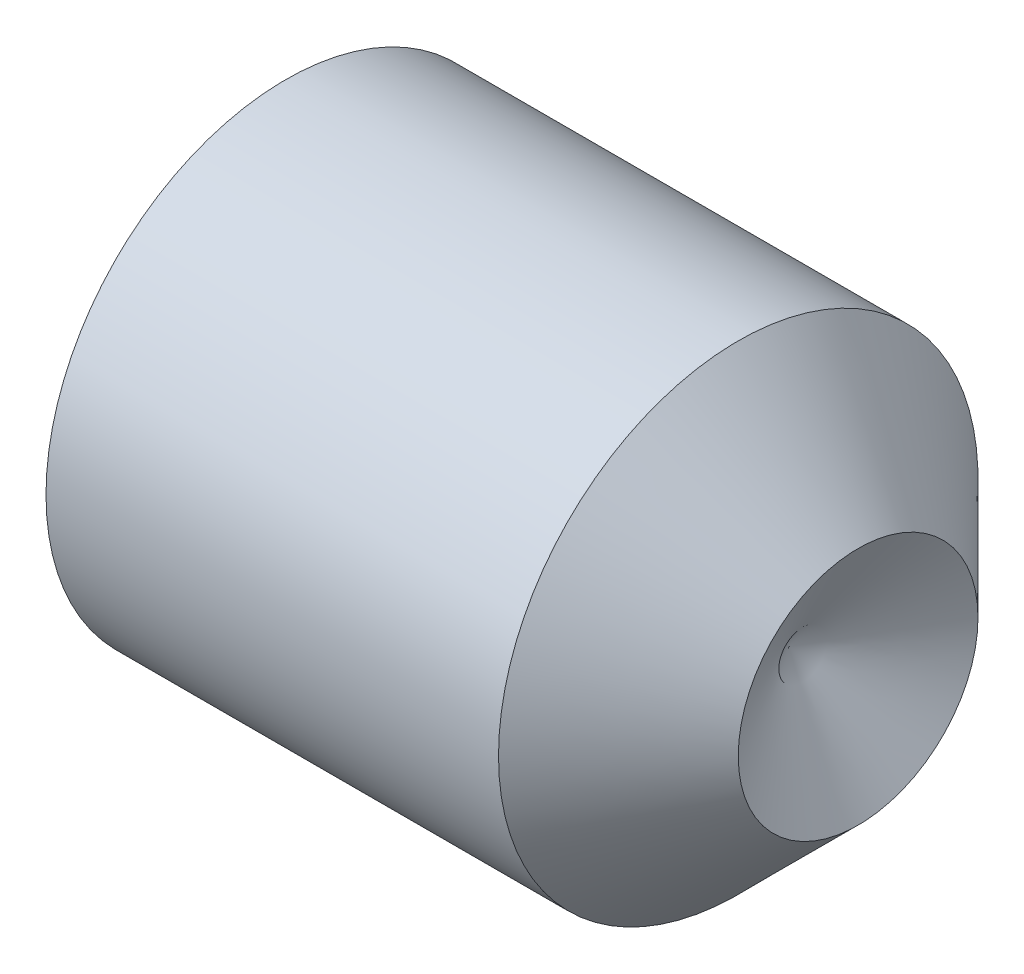
ISO-10303-21;
HEADER;
FILE_DESCRIPTION(('STEP AP214'),'2;1');
FILE_NAME('part.step','',(''),(''),'','','');
FILE_SCHEMA(('AUTOMOTIVE_DESIGN { 1 0 10303 214 1 1 1 1 }'));
ENDSEC;
DATA;
#1=APPLICATION_CONTEXT('core data for automotive mechanical design processes');
#2=APPLICATION_PROTOCOL_DEFINITION('international standard','automotive_design',2000,#1);
#3=PRODUCT_CONTEXT('',#1,'mechanical');
#4=PRODUCT('Part','Part','',(#3));
#5=PRODUCT_RELATED_PRODUCT_CATEGORY('part','',(#4));
#6=PRODUCT_DEFINITION_FORMATION('','',#4);
#7=PRODUCT_DEFINITION_CONTEXT('part definition',#1,'design');
#8=PRODUCT_DEFINITION('design','',#6,#7);
#9=PRODUCT_DEFINITION_SHAPE('','',#8);
#10=(LENGTH_UNIT() NAMED_UNIT(*) SI_UNIT(.MILLI.,.METRE.));
#11=(NAMED_UNIT(*) PLANE_ANGLE_UNIT() SI_UNIT($,.RADIAN.));
#12=(NAMED_UNIT(*) SI_UNIT($,.STERADIAN.) SOLID_ANGLE_UNIT());
#13=UNCERTAINTY_MEASURE_WITH_UNIT(LENGTH_MEASURE(1.E-05),#10,'distance_accuracy_value','');
#14=(GEOMETRIC_REPRESENTATION_CONTEXT(3) GLOBAL_UNCERTAINTY_ASSIGNED_CONTEXT((#13)) GLOBAL_UNIT_ASSIGNED_CONTEXT((#10,
#11,#12)) REPRESENTATION_CONTEXT('',''));
#15=CARTESIAN_POINT('',(0.,0.,0.));
#16=DIRECTION('',(0.,0.,1.));
#17=DIRECTION('',(1.,0.,0.));
#18=AXIS2_PLACEMENT_3D('',#15,#16,#17);
#19=CARTESIAN_POINT('',(0.,0.,0.));
#20=DIRECTION('',(-1.,0.,0.));
#21=DIRECTION('',(0.,0.,1.));
#22=AXIS2_PLACEMENT_3D('',#19,#20,#21);
#23=PLANE('',#22);
#24=CARTESIAN_POINT('',(0.,0.,0.));
#25=DIRECTION('',(-1.,0.,0.));
#26=DIRECTION('',(0.,0.,1.));
#27=AXIS2_PLACEMENT_3D('',#24,#25,#26);
#28=CIRCLE('',#27,1.61);
#29=CARTESIAN_POINT('',(0.,0.,1.61));
#30=VERTEX_POINT('',#29);
#31=EDGE_CURVE('E11',#30,#30,#28,.T.);
#32=ORIENTED_EDGE('',*,*,#31,.T.);
#33=EDGE_LOOP('',(#32));
#34=FACE_BOUND('',#33,.T.);
#35=DIRECTION('',(0.,0.,-1.));
#36=VECTOR('',#35,1.);
#37=CARTESIAN_POINT('',(0.,1.,0.577350269189623));
#38=LINE('',#37,#36);
#39=CARTESIAN_POINT('',(0.,1.,0.577350269189623));
#40=VERTEX_POINT('',#39);
#41=CARTESIAN_POINT('',(0.,1.,-0.577350269189629));
#42=VERTEX_POINT('',#41);
#43=EDGE_CURVE('E95',#40,#42,#38,.T.);
#44=ORIENTED_EDGE('',*,*,#43,.F.);
#45=DIRECTION('',(0.,-0.866025403784439,0.5));
#46=VECTOR('',#45,1.);
#47=CARTESIAN_POINT('',(0.,1.,0.577350269189623));
#48=LINE('',#47,#46);
#49=CARTESIAN_POINT('',(0.,0.,1.15470053837925));
#50=VERTEX_POINT('',#49);
#51=EDGE_CURVE('E48',#40,#50,#48,.T.);
#52=ORIENTED_EDGE('',*,*,#51,.T.);
#53=DIRECTION('',(0.,0.866025403784439,0.5));
#54=VECTOR('',#53,1.);
#55=CARTESIAN_POINT('',(0.,-0.999999999999997,0.577350269189623));
#56=LINE('',#55,#54);
#57=CARTESIAN_POINT('',(0.,-0.999999999999997,0.577350269189623));
#58=VERTEX_POINT('',#57);
#59=EDGE_CURVE('E101',#58,#50,#56,.T.);
#60=ORIENTED_EDGE('',*,*,#59,.F.);
#61=DIRECTION('',(0.,0.,-1.));
#62=VECTOR('',#61,1.);
#63=CARTESIAN_POINT('',(0.,-0.999999999999997,0.577350269189623));
#64=LINE('',#63,#62);
#65=CARTESIAN_POINT('',(0.,-0.999999999999997,-0.577350269189628));
#66=VERTEX_POINT('',#65);
#67=EDGE_CURVE('E121',#58,#66,#64,.T.);
#68=ORIENTED_EDGE('',*,*,#67,.T.);
#69=DIRECTION('',(0.,0.866025403784439,-0.5));
#70=VECTOR('',#69,1.);
#71=CARTESIAN_POINT('',(0.,-0.999999999999997,-0.577350269189628));
#72=LINE('',#71,#70);
#73=CARTESIAN_POINT('',(0.,0.,-1.15470053837925));
#74=VERTEX_POINT('',#73);
#75=EDGE_CURVE('E124',#66,#74,#72,.T.);
#76=ORIENTED_EDGE('',*,*,#75,.T.);
#77=DIRECTION('',(0.,-0.866025403784439,-0.499999999999999));
#78=VECTOR('',#77,1.);
#79=CARTESIAN_POINT('',(0.,1.,-0.577350269189629));
#80=LINE('',#79,#78);
#81=EDGE_CURVE('E127',#42,#74,#80,.T.);
#82=ORIENTED_EDGE('',*,*,#81,.F.);
#83=EDGE_LOOP('',(#44,#52,#60,#68,#76,#82));
#84=FACE_BOUND('',#83,.T.);
#85=ADVANCED_FACE('F34',(#34,#84),#23,.T.);
#86=CARTESIAN_POINT('',(0.,0.,0.));
#87=DIRECTION('',(1.,0.,0.));
#88=DIRECTION('',(0.,0.,-1.));
#89=AXIS2_PLACEMENT_3D('',#86,#87,#88);
#90=CONICAL_SURFACE('',#89,1.61,1.0471975511966);
#91=CARTESIAN_POINT('',(0.225166604983952,0.,0.));
#92=DIRECTION('',(-1.,0.,0.));
#93=DIRECTION('',(0.,0.,1.));
#94=AXIS2_PLACEMENT_3D('',#91,#92,#93);
#95=CIRCLE('',#94,2.);
#96=CARTESIAN_POINT('',(0.225166604983952,0.,2.));
#97=VERTEX_POINT('',#96);
#98=EDGE_CURVE('E41',#97,#97,#95,.T.);
#99=ORIENTED_EDGE('',*,*,#98,.T.);
#100=EDGE_LOOP('',(#99));
#101=FACE_BOUND('',#100,.T.);
#102=ORIENTED_EDGE('',*,*,#31,.F.);
#103=EDGE_LOOP('',(#102));
#104=FACE_BOUND('',#103,.T.);
#105=ADVANCED_FACE('F147',(#101,#104),#90,.T.);
#106=CARTESIAN_POINT('',(-12.7,0.,0.));
#107=DIRECTION('',(-1.,0.,0.));
#108=DIRECTION('',(0.,0.,1.));
#109=AXIS2_PLACEMENT_3D('',#106,#107,#108);
#110=CYLINDRICAL_SURFACE('',#109,2.);
#111=CARTESIAN_POINT('',(4.,0.,0.));
#112=DIRECTION('',(-1.,0.,0.));
#113=DIRECTION('',(0.,0.,1.));
#114=AXIS2_PLACEMENT_3D('',#111,#112,#113);
#115=CIRCLE('',#114,2.);
#116=CARTESIAN_POINT('',(4.,0.,2.));
#117=VERTEX_POINT('',#116);
#118=EDGE_CURVE('E142',#117,#117,#115,.T.);
#119=ORIENTED_EDGE('',*,*,#118,.T.);
#120=EDGE_LOOP('',(#119));
#121=FACE_BOUND('',#120,.T.);
#122=ORIENTED_EDGE('',*,*,#98,.F.);
#123=EDGE_LOOP('',(#122));
#124=FACE_BOUND('',#123,.T.);
#125=ADVANCED_FACE('F150',(#121,#124),#110,.T.);
#126=CARTESIAN_POINT('',(4.,0.,0.));
#127=DIRECTION('',(-1.,0.,0.));
#128=DIRECTION('',(0.,0.,1.));
#129=AXIS2_PLACEMENT_3D('',#126,#127,#128);
#130=CONICAL_SURFACE('',#129,2.,0.785398163397448);
#131=CARTESIAN_POINT('',(5.,0.,0.));
#132=DIRECTION('',(-1.,0.,0.));
#133=DIRECTION('',(0.,0.,1.));
#134=AXIS2_PLACEMENT_3D('',#131,#132,#133);
#135=CIRCLE('',#134,1.);
#136=CARTESIAN_POINT('',(5.,0.,1.));
#137=VERTEX_POINT('',#136);
#138=EDGE_CURVE('E102',#137,#137,#135,.T.);
#139=ORIENTED_EDGE('',*,*,#138,.T.);
#140=EDGE_LOOP('',(#139));
#141=FACE_BOUND('',#140,.T.);
#142=ORIENTED_EDGE('',*,*,#118,.F.);
#143=EDGE_LOOP('',(#142));
#144=FACE_BOUND('',#143,.T.);
#145=ADVANCED_FACE('F152',(#141,#144),#130,.T.);
#146=CARTESIAN_POINT('',(4.42264973081036,0.,0.));
#147=DIRECTION('',(1.,0.,0.));
#148=DIRECTION('',(0.,0.,-1.));
#149=AXIS2_PLACEMENT_3D('',#146,#147,#148);
#150=CONICAL_SURFACE('',#149,0.,1.04719755119659);
#151=ORIENTED_EDGE('',*,*,#138,.F.);
#152=EDGE_LOOP('',(#151));
#153=FACE_BOUND('',#152,.T.);
#154=CARTESIAN_POINT('',(4.42264973081036,0.,0.));
#155=VERTEX_POINT('',#154);
#156=VERTEX_LOOP('',#155);
#157=FACE_BOUND('',#156,.T.);
#158=ADVANCED_FACE('F159',(#153,#157),#150,.F.);
#159=CARTESIAN_POINT('',(1.5,1.,0.577350269189623));
#160=DIRECTION('',(0.,-0.5,-0.866025403784439));
#161=DIRECTION('',(0.,0.866025403784439,-0.5));
#162=AXIS2_PLACEMENT_3D('',#159,#160,#161);
#163=PLANE('',#162);
#164=ORIENTED_EDGE('',*,*,#51,.F.);
#165=DIRECTION('',(-1.,0.,0.));
#166=VECTOR('',#165,1.);
#167=CARTESIAN_POINT('',(1.5,1.,0.577350269189623));
#168=LINE('',#167,#166);
#169=CARTESIAN_POINT('',(1.5,1.,0.577350269189623));
#170=VERTEX_POINT('',#169);
#171=EDGE_CURVE('E89',#170,#40,#168,.T.);
#172=ORIENTED_EDGE('',*,*,#171,.F.);
#173=DIRECTION('',(0.,-0.866025403784439,0.5));
#174=VECTOR('',#173,1.);
#175=CARTESIAN_POINT('',(1.5,1.,0.577350269189623));
#176=LINE('',#175,#174);
#177=CARTESIAN_POINT('',(1.5,0.,1.15470053837925));
#178=VERTEX_POINT('',#177);
#179=EDGE_CURVE('E84',#170,#178,#176,.T.);
#180=ORIENTED_EDGE('',*,*,#179,.T.);
#181=DIRECTION('',(-1.,0.,0.));
#182=VECTOR('',#181,1.);
#183=CARTESIAN_POINT('',(1.5,0.,1.15470053837925));
#184=LINE('',#183,#182);
#185=EDGE_CURVE('E87',#178,#50,#184,.T.);
#186=ORIENTED_EDGE('',*,*,#185,.T.);
#187=EDGE_LOOP('',(#164,#172,#180,#186));
#188=FACE_BOUND('',#187,.T.);
#189=ADVANCED_FACE('F86',(#188),#163,.T.);
#190=CARTESIAN_POINT('',(1.5,-0.999999999999997,0.577350269189623));
#191=DIRECTION('',(0.,-0.5,0.866025403784439));
#192=DIRECTION('',(0.,-0.866025403784439,-0.5));
#193=AXIS2_PLACEMENT_3D('',#190,#191,#192);
#194=PLANE('',#193);
#195=ORIENTED_EDGE('',*,*,#59,.T.);
#196=ORIENTED_EDGE('',*,*,#185,.F.);
#197=DIRECTION('',(0.,0.866025403784439,0.5));
#198=VECTOR('',#197,1.);
#199=CARTESIAN_POINT('',(1.5,-0.999999999999997,0.577350269189623));
#200=LINE('',#199,#198);
#201=CARTESIAN_POINT('',(1.5,-0.999999999999997,0.577350269189623));
#202=VERTEX_POINT('',#201);
#203=EDGE_CURVE('E94',#202,#178,#200,.T.);
#204=ORIENTED_EDGE('',*,*,#203,.F.);
#205=DIRECTION('',(-1.,0.,0.));
#206=VECTOR('',#205,1.);
#207=CARTESIAN_POINT('',(1.5,-0.999999999999997,0.577350269189623));
#208=LINE('',#207,#206);
#209=EDGE_CURVE('E103',#202,#58,#208,.T.);
#210=ORIENTED_EDGE('',*,*,#209,.T.);
#211=EDGE_LOOP('',(#195,#196,#204,#210));
#212=FACE_BOUND('',#211,.T.);
#213=ADVANCED_FACE('F99',(#212),#194,.F.);
#214=CARTESIAN_POINT('',(1.5,-0.999999999999997,0.577350269189623));
#215=DIRECTION('',(0.,1.,0.));
#216=DIRECTION('',(0.,0.,1.));
#217=AXIS2_PLACEMENT_3D('',#214,#215,#216);
#218=PLANE('',#217);
#219=ORIENTED_EDGE('',*,*,#67,.F.);
#220=ORIENTED_EDGE('',*,*,#209,.F.);
#221=DIRECTION('',(0.,0.,-1.));
#222=VECTOR('',#221,1.);
#223=CARTESIAN_POINT('',(1.5,-0.999999999999997,0.577350269189623));
#224=LINE('',#223,#222);
#225=CARTESIAN_POINT('',(1.5,-0.999999999999997,-0.577350269189628));
#226=VERTEX_POINT('',#225);
#227=EDGE_CURVE('E108',#202,#226,#224,.T.);
#228=ORIENTED_EDGE('',*,*,#227,.T.);
#229=DIRECTION('',(-1.,0.,0.));
#230=VECTOR('',#229,1.);
#231=CARTESIAN_POINT('',(1.5,-0.999999999999997,-0.577350269189628));
#232=LINE('',#231,#230);
#233=EDGE_CURVE('E137',#226,#66,#232,.T.);
#234=ORIENTED_EDGE('',*,*,#233,.T.);
#235=EDGE_LOOP('',(#219,#220,#228,#234));
#236=FACE_BOUND('',#235,.T.);
#237=ADVANCED_FACE('F182',(#236),#218,.T.);
#238=CARTESIAN_POINT('',(1.5,-0.999999999999997,-0.577350269189628));
#239=DIRECTION('',(0.,0.5,0.866025403784439));
#240=DIRECTION('',(0.,-0.866025403784439,0.5));
#241=AXIS2_PLACEMENT_3D('',#238,#239,#240);
#242=PLANE('',#241);
#243=ORIENTED_EDGE('',*,*,#75,.F.);
#244=ORIENTED_EDGE('',*,*,#233,.F.);
#245=DIRECTION('',(0.,0.866025403784439,-0.5));
#246=VECTOR('',#245,1.);
#247=CARTESIAN_POINT('',(1.5,-0.999999999999997,-0.577350269189628));
#248=LINE('',#247,#246);
#249=CARTESIAN_POINT('',(1.5,0.,-1.15470053837925));
#250=VERTEX_POINT('',#249);
#251=EDGE_CURVE('E110',#226,#250,#248,.T.);
#252=ORIENTED_EDGE('',*,*,#251,.T.);
#253=DIRECTION('',(-1.,0.,0.));
#254=VECTOR('',#253,1.);
#255=CARTESIAN_POINT('',(1.5,0.,-1.15470053837925));
#256=LINE('',#255,#254);
#257=EDGE_CURVE('E135',#250,#74,#256,.T.);
#258=ORIENTED_EDGE('',*,*,#257,.T.);
#259=EDGE_LOOP('',(#243,#244,#252,#258));
#260=FACE_BOUND('',#259,.T.);
#261=ADVANCED_FACE('F178',(#260),#242,.T.);
#262=CARTESIAN_POINT('',(1.5,1.,-0.577350269189629));
#263=DIRECTION('',(0.,0.5,-0.866025403784439));
#264=DIRECTION('',(0.,0.866025403784439,0.5));
#265=AXIS2_PLACEMENT_3D('',#262,#263,#264);
#266=PLANE('',#265);
#267=ORIENTED_EDGE('',*,*,#81,.T.);
#268=ORIENTED_EDGE('',*,*,#257,.F.);
#269=DIRECTION('',(0.,-0.866025403784439,-0.499999999999999));
#270=VECTOR('',#269,1.);
#271=CARTESIAN_POINT('',(1.5,1.,-0.577350269189629));
#272=LINE('',#271,#270);
#273=CARTESIAN_POINT('',(1.5,1.,-0.577350269189629));
#274=VERTEX_POINT('',#273);
#275=EDGE_CURVE('E114',#274,#250,#272,.T.);
#276=ORIENTED_EDGE('',*,*,#275,.F.);
#277=DIRECTION('',(-1.,0.,0.));
#278=VECTOR('',#277,1.);
#279=CARTESIAN_POINT('',(1.5,1.,-0.577350269189629));
#280=LINE('',#279,#278);
#281=EDGE_CURVE('E133',#274,#42,#280,.T.);
#282=ORIENTED_EDGE('',*,*,#281,.T.);
#283=EDGE_LOOP('',(#267,#268,#276,#282));
#284=FACE_BOUND('',#283,.T.);
#285=ADVANCED_FACE('F175',(#284),#266,.F.);
#286=CARTESIAN_POINT('',(1.5,1.,0.577350269189623));
#287=DIRECTION('',(0.,1.,0.));
#288=DIRECTION('',(0.,0.,1.));
#289=AXIS2_PLACEMENT_3D('',#286,#287,#288);
#290=PLANE('',#289);
#291=ORIENTED_EDGE('',*,*,#43,.T.);
#292=ORIENTED_EDGE('',*,*,#281,.F.);
#293=DIRECTION('',(0.,0.,-1.));
#294=VECTOR('',#293,1.);
#295=CARTESIAN_POINT('',(1.5,1.,0.577350269189623));
#296=LINE('',#295,#294);
#297=EDGE_CURVE('E117',#170,#274,#296,.T.);
#298=ORIENTED_EDGE('',*,*,#297,.F.);
#299=ORIENTED_EDGE('',*,*,#171,.T.);
#300=EDGE_LOOP('',(#291,#292,#298,#299));
#301=FACE_BOUND('',#300,.T.);
#302=ADVANCED_FACE('F171',(#301),#290,.F.);
#303=CARTESIAN_POINT('',(1.5,-0.999999999999997,1.73205080756887));
#304=DIRECTION('',(1.,0.,0.));
#305=DIRECTION('',(0.,0.,-1.));
#306=AXIS2_PLACEMENT_3D('',#303,#304,#305);
#307=PLANE('',#306);
#308=ORIENTED_EDGE('',*,*,#179,.F.);
#309=ORIENTED_EDGE('',*,*,#297,.T.);
#310=ORIENTED_EDGE('',*,*,#275,.T.);
#311=ORIENTED_EDGE('',*,*,#251,.F.);
#312=ORIENTED_EDGE('',*,*,#227,.F.);
#313=ORIENTED_EDGE('',*,*,#203,.T.);
#314=EDGE_LOOP('',(#308,#309,#310,#311,#312,#313));
#315=FACE_BOUND('',#314,.T.);
#316=ADVANCED_FACE('F106',(#315),#307,.F.);
#317=CLOSED_SHELL('',(#85,#105,#125,#145,#158,#189,#213,#237,#261,#285,#302,#316));
#318=MANIFOLD_SOLID_BREP('B2',#317);
#319=ADVANCED_BREP_SHAPE_REPRESENTATION('',(#18,#318),#14);
#320=SHAPE_DEFINITION_REPRESENTATION(#9,#319);
ENDSEC;
END-ISO-10303-21;
